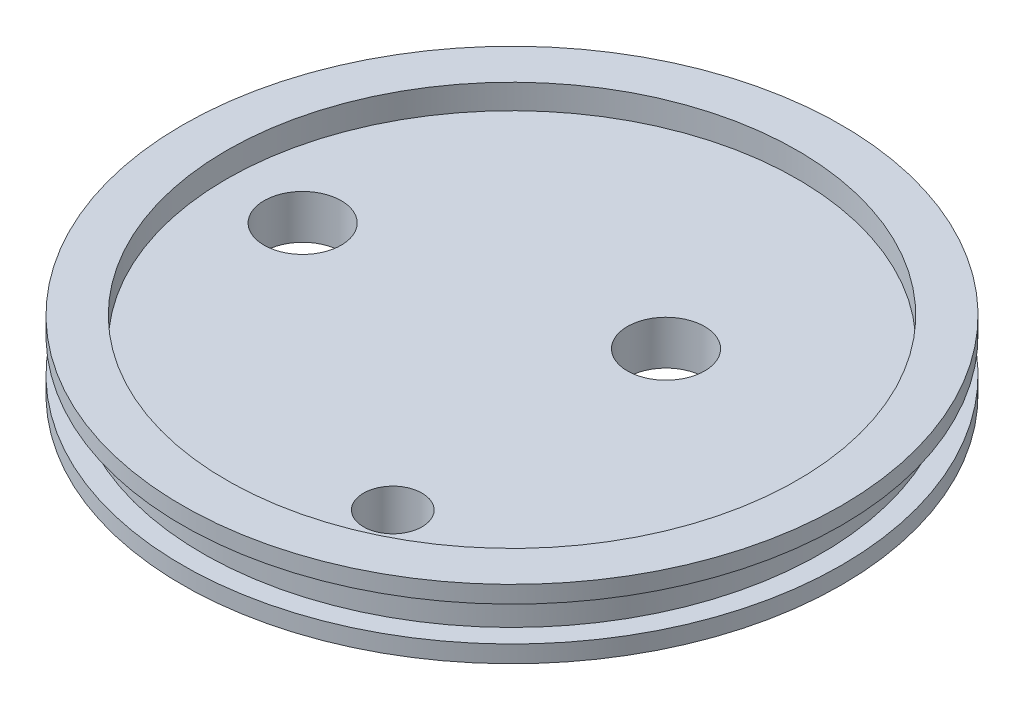
ISO-10303-21;
HEADER;
FILE_DESCRIPTION(('STEP AP214'),'2;1');
FILE_NAME('part.step','',(''),(''),'','','');
FILE_SCHEMA(('AUTOMOTIVE_DESIGN { 1 0 10303 214 1 1 1 1 }'));
ENDSEC;
DATA;
#1=APPLICATION_CONTEXT('core data for automotive mechanical design processes');
#2=APPLICATION_PROTOCOL_DEFINITION('international standard','automotive_design',2000,#1);
#3=PRODUCT_CONTEXT('',#1,'mechanical');
#4=PRODUCT('Part','Part','',(#3));
#5=PRODUCT_RELATED_PRODUCT_CATEGORY('part','',(#4));
#6=PRODUCT_DEFINITION_FORMATION('','',#4);
#7=PRODUCT_DEFINITION_CONTEXT('part definition',#1,'design');
#8=PRODUCT_DEFINITION('design','',#6,#7);
#9=PRODUCT_DEFINITION_SHAPE('','',#8);
#10=(LENGTH_UNIT() NAMED_UNIT(*) SI_UNIT(.MILLI.,.METRE.));
#11=(NAMED_UNIT(*) PLANE_ANGLE_UNIT() SI_UNIT($,.RADIAN.));
#12=(NAMED_UNIT(*) SI_UNIT($,.STERADIAN.) SOLID_ANGLE_UNIT());
#13=UNCERTAINTY_MEASURE_WITH_UNIT(LENGTH_MEASURE(1.E-05),#10,'distance_accuracy_value','');
#14=(GEOMETRIC_REPRESENTATION_CONTEXT(3) GLOBAL_UNCERTAINTY_ASSIGNED_CONTEXT((#13)) GLOBAL_UNIT_ASSIGNED_CONTEXT((#10,
#11,#12)) REPRESENTATION_CONTEXT('',''));
#15=CARTESIAN_POINT('',(0.,0.,0.));
#16=DIRECTION('',(0.,0.,1.));
#17=DIRECTION('',(1.,0.,0.));
#18=AXIS2_PLACEMENT_3D('',#15,#16,#17);
#19=CARTESIAN_POINT('',(0.,0.,0.));
#20=DIRECTION('',(0.,1.,0.));
#21=DIRECTION('',(-1.,0.,0.));
#22=AXIS2_PLACEMENT_3D('',#19,#20,#21);
#23=PLANE('',#22);
#24=CARTESIAN_POINT('',(11.7143411437088,0.,-10.4858709114097));
#25=DIRECTION('',(0.,1.,0.));
#26=DIRECTION('',(-1.,0.,0.));
#27=AXIS2_PLACEMENT_3D('',#24,#25,#26);
#28=CIRCLE('',#27,5.56259999999999);
#29=CARTESIAN_POINT('',(6.15174114370876,0.,-10.4858709114097));
#30=VERTEX_POINT('',#29);
#31=EDGE_CURVE('E79',#30,#30,#28,.T.);
#32=ORIENTED_EDGE('',*,*,#31,.T.);
#33=EDGE_LOOP('',(#32));
#34=FACE_BOUND('',#33,.T.);
#35=CARTESIAN_POINT('',(12.1501989775916,0.,29.3331751572333));
#36=DIRECTION('',(0.,1.,0.));
#37=DIRECTION('',(0.,0.,1.));
#38=AXIS2_PLACEMENT_3D('',#35,#36,#37);
#39=CIRCLE('',#38,4.2164);
#40=CARTESIAN_POINT('',(12.1501989775916,0.,33.5495751572333));
#41=VERTEX_POINT('',#40);
#42=EDGE_CURVE('E73',#41,#41,#39,.T.);
#43=ORIENTED_EDGE('',*,*,#42,.T.);
#44=EDGE_LOOP('',(#43));
#45=FACE_BOUND('',#44,.T.);
#46=CARTESIAN_POINT('',(-30.1752,0.,0.));
#47=DIRECTION('',(0.,1.,0.));
#48=DIRECTION('',(0.,0.,1.));
#49=AXIS2_PLACEMENT_3D('',#46,#47,#48);
#50=CIRCLE('',#49,5.5626);
#51=CARTESIAN_POINT('',(-30.1752,0.,5.5626));
#52=VERTEX_POINT('',#51);
#53=EDGE_CURVE('E67',#52,#52,#50,.T.);
#54=ORIENTED_EDGE('',*,*,#53,.T.);
#55=EDGE_LOOP('',(#54));
#56=FACE_BOUND('',#55,.T.);
#57=CARTESIAN_POINT('',(0.,0.,0.));
#58=DIRECTION('',(0.,1.,0.));
#59=DIRECTION('',(-1.,0.,0.));
#60=AXIS2_PLACEMENT_3D('',#57,#58,#59);
#61=CIRCLE('',#60,47.498);
#62=CARTESIAN_POINT('',(-47.498,0.,0.));
#63=VERTEX_POINT('',#62);
#64=EDGE_CURVE('E10',#63,#63,#61,.T.);
#65=ORIENTED_EDGE('',*,*,#64,.F.);
#66=EDGE_LOOP('',(#65));
#67=FACE_BOUND('',#66,.T.);
#68=ADVANCED_FACE('F36',(#34,#45,#56,#67),#23,.F.);
#69=CARTESIAN_POINT('',(0.,48.1922132313012,0.));
#70=DIRECTION('',(0.,1.,0.));
#71=DIRECTION('',(-1.,0.,0.));
#72=AXIS2_PLACEMENT_3D('',#69,#70,#71);
#73=CYLINDRICAL_SURFACE('',#72,47.498);
#74=CARTESIAN_POINT('',(0.,2.4638,0.));
#75=DIRECTION('',(0.,1.,0.));
#76=DIRECTION('',(-1.,0.,0.));
#77=AXIS2_PLACEMENT_3D('',#74,#75,#76);
#78=CIRCLE('',#77,47.498);
#79=CARTESIAN_POINT('',(-47.498,2.46379999999999,0.));
#80=VERTEX_POINT('',#79);
#81=EDGE_CURVE('E42',#80,#80,#78,.T.);
#82=ORIENTED_EDGE('',*,*,#81,.F.);
#83=EDGE_LOOP('',(#82));
#84=FACE_BOUND('',#83,.T.);
#85=ORIENTED_EDGE('',*,*,#64,.T.);
#86=EDGE_LOOP('',(#85));
#87=FACE_BOUND('',#86,.T.);
#88=ADVANCED_FACE('F131',(#84,#87),#73,.T.);
#89=CARTESIAN_POINT('',(47.498,2.4638,0.));
#90=DIRECTION('',(0.,-1.,0.));
#91=DIRECTION('',(1.,0.,0.));
#92=AXIS2_PLACEMENT_3D('',#89,#90,#91);
#93=PLANE('',#92);
#94=CARTESIAN_POINT('',(0.,2.4638,0.));
#95=DIRECTION('',(0.,1.,0.));
#96=DIRECTION('',(-1.,0.,0.));
#97=AXIS2_PLACEMENT_3D('',#94,#95,#96);
#98=CIRCLE('',#97,44.577);
#99=CARTESIAN_POINT('',(-44.577,2.46379999999999,0.));
#100=VERTEX_POINT('',#99);
#101=EDGE_CURVE('E46',#100,#100,#98,.T.);
#102=ORIENTED_EDGE('',*,*,#101,.F.);
#103=EDGE_LOOP('',(#102));
#104=FACE_BOUND('',#103,.T.);
#105=ORIENTED_EDGE('',*,*,#81,.T.);
#106=EDGE_LOOP('',(#105));
#107=FACE_BOUND('',#106,.T.);
#108=ADVANCED_FACE('F126',(#104,#107),#93,.F.);
#109=CARTESIAN_POINT('',(0.,48.1922132313012,0.));
#110=DIRECTION('',(0.,1.,0.));
#111=DIRECTION('',(-1.,0.,0.));
#112=AXIS2_PLACEMENT_3D('',#109,#110,#111);
#113=CYLINDRICAL_SURFACE('',#112,44.577);
#114=CARTESIAN_POINT('',(0.,7.44219999999999,0.));
#115=DIRECTION('',(0.,1.,0.));
#116=DIRECTION('',(-1.,0.,0.));
#117=AXIS2_PLACEMENT_3D('',#114,#115,#116);
#118=CIRCLE('',#117,44.577);
#119=CARTESIAN_POINT('',(-44.577,7.44219999999998,0.));
#120=VERTEX_POINT('',#119);
#121=EDGE_CURVE('E50',#120,#120,#118,.T.);
#122=ORIENTED_EDGE('',*,*,#121,.F.);
#123=EDGE_LOOP('',(#122));
#124=FACE_BOUND('',#123,.T.);
#125=ORIENTED_EDGE('',*,*,#101,.T.);
#126=EDGE_LOOP('',(#125));
#127=FACE_BOUND('',#126,.T.);
#128=ADVANCED_FACE('F120',(#124,#127),#113,.T.);
#129=CARTESIAN_POINT('',(44.577,7.4422,0.));
#130=DIRECTION('',(0.,1.,0.));
#131=DIRECTION('',(-1.,0.,0.));
#132=AXIS2_PLACEMENT_3D('',#129,#130,#131);
#133=PLANE('',#132);
#134=CARTESIAN_POINT('',(0.,7.44219999999999,0.));
#135=DIRECTION('',(0.,1.,0.));
#136=DIRECTION('',(-1.,0.,0.));
#137=AXIS2_PLACEMENT_3D('',#134,#135,#136);
#138=CIRCLE('',#137,47.498);
#139=CARTESIAN_POINT('',(-47.498,7.44219999999998,0.));
#140=VERTEX_POINT('',#139);
#141=EDGE_CURVE('E55',#140,#140,#138,.T.);
#142=ORIENTED_EDGE('',*,*,#141,.F.);
#143=EDGE_LOOP('',(#142));
#144=FACE_BOUND('',#143,.T.);
#145=ORIENTED_EDGE('',*,*,#121,.T.);
#146=EDGE_LOOP('',(#145));
#147=FACE_BOUND('',#146,.T.);
#148=ADVANCED_FACE('F114',(#144,#147),#133,.F.);
#149=CARTESIAN_POINT('',(0.,48.1922132313012,0.));
#150=DIRECTION('',(0.,1.,0.));
#151=DIRECTION('',(-1.,0.,0.));
#152=AXIS2_PLACEMENT_3D('',#149,#150,#151);
#153=CYLINDRICAL_SURFACE('',#152,47.498);
#154=CARTESIAN_POINT('',(0.,9.90599999999999,0.));
#155=DIRECTION('',(0.,1.,0.));
#156=DIRECTION('',(-1.,0.,0.));
#157=AXIS2_PLACEMENT_3D('',#154,#155,#156);
#158=CIRCLE('',#157,47.498);
#159=CARTESIAN_POINT('',(-47.498,9.90599999999999,0.));
#160=VERTEX_POINT('',#159);
#161=EDGE_CURVE('E58',#160,#160,#158,.T.);
#162=ORIENTED_EDGE('',*,*,#161,.F.);
#163=EDGE_LOOP('',(#162));
#164=FACE_BOUND('',#163,.T.);
#165=ORIENTED_EDGE('',*,*,#141,.T.);
#166=EDGE_LOOP('',(#165));
#167=FACE_BOUND('',#166,.T.);
#168=ADVANCED_FACE('F108',(#164,#167),#153,.T.);
#169=CARTESIAN_POINT('',(47.498,9.906,0.));
#170=DIRECTION('',(0.,-1.,0.));
#171=DIRECTION('',(1.,0.,0.));
#172=AXIS2_PLACEMENT_3D('',#169,#170,#171);
#173=PLANE('',#172);
#174=CARTESIAN_POINT('',(0.,9.90599999999999,0.));
#175=DIRECTION('',(0.,1.,0.));
#176=DIRECTION('',(-1.,0.,0.));
#177=AXIS2_PLACEMENT_3D('',#174,#175,#176);
#178=CIRCLE('',#177,41.148);
#179=CARTESIAN_POINT('',(-41.148,9.90599999999999,0.));
#180=VERTEX_POINT('',#179);
#181=EDGE_CURVE('E61',#180,#180,#178,.T.);
#182=ORIENTED_EDGE('',*,*,#181,.F.);
#183=EDGE_LOOP('',(#182));
#184=FACE_BOUND('',#183,.T.);
#185=ORIENTED_EDGE('',*,*,#161,.T.);
#186=EDGE_LOOP('',(#185));
#187=FACE_BOUND('',#186,.T.);
#188=ADVANCED_FACE('F102',(#184,#187),#173,.F.);
#189=CARTESIAN_POINT('',(0.,48.1922132313012,0.));
#190=DIRECTION('',(0.,1.,0.));
#191=DIRECTION('',(-1.,0.,0.));
#192=AXIS2_PLACEMENT_3D('',#189,#190,#191);
#193=CYLINDRICAL_SURFACE('',#192,41.148);
#194=CARTESIAN_POINT('',(0.,6.34999999999999,0.));
#195=DIRECTION('',(0.,1.,0.));
#196=DIRECTION('',(-1.,0.,0.));
#197=AXIS2_PLACEMENT_3D('',#194,#195,#196);
#198=CIRCLE('',#197,41.148);
#199=CARTESIAN_POINT('',(-41.148,6.34999999999999,0.));
#200=VERTEX_POINT('',#199);
#201=EDGE_CURVE('E64',#200,#200,#198,.T.);
#202=ORIENTED_EDGE('',*,*,#201,.F.);
#203=EDGE_LOOP('',(#202));
#204=FACE_BOUND('',#203,.T.);
#205=ORIENTED_EDGE('',*,*,#181,.T.);
#206=EDGE_LOOP('',(#205));
#207=FACE_BOUND('',#206,.T.);
#208=ADVANCED_FACE('F92',(#204,#207),#193,.F.);
#209=CARTESIAN_POINT('',(41.148,6.35,0.));
#210=DIRECTION('',(0.,-1.,0.));
#211=DIRECTION('',(1.,0.,0.));
#212=AXIS2_PLACEMENT_3D('',#209,#210,#211);
#213=PLANE('',#212);
#214=CARTESIAN_POINT('',(11.7143411437088,6.35,-10.4858709114097));
#215=DIRECTION('',(0.,1.,0.));
#216=DIRECTION('',(0.,0.,1.));
#217=AXIS2_PLACEMENT_3D('',#214,#215,#216);
#218=CIRCLE('',#217,5.56259999999999);
#219=CARTESIAN_POINT('',(11.7143411437088,6.35,-4.92327091140974));
#220=VERTEX_POINT('',#219);
#221=EDGE_CURVE('E82',#220,#220,#218,.T.);
#222=ORIENTED_EDGE('',*,*,#221,.F.);
#223=EDGE_LOOP('',(#222));
#224=FACE_BOUND('',#223,.T.);
#225=CARTESIAN_POINT('',(12.1501989775916,6.35,29.3331751572333));
#226=DIRECTION('',(0.,1.,0.));
#227=DIRECTION('',(0.,0.,1.));
#228=AXIS2_PLACEMENT_3D('',#225,#226,#227);
#229=CIRCLE('',#228,4.2164);
#230=CARTESIAN_POINT('',(12.1501989775916,6.35,33.5495751572333));
#231=VERTEX_POINT('',#230);
#232=EDGE_CURVE('E76',#231,#231,#229,.T.);
#233=ORIENTED_EDGE('',*,*,#232,.F.);
#234=EDGE_LOOP('',(#233));
#235=FACE_BOUND('',#234,.T.);
#236=CARTESIAN_POINT('',(-30.1752,6.34999999999999,0.));
#237=DIRECTION('',(0.,1.,0.));
#238=DIRECTION('',(0.,0.,1.));
#239=AXIS2_PLACEMENT_3D('',#236,#237,#238);
#240=CIRCLE('',#239,5.56259999999999);
#241=CARTESIAN_POINT('',(-30.1752,6.34999999999999,5.56259999999999));
#242=VERTEX_POINT('',#241);
#243=EDGE_CURVE('E70',#242,#242,#240,.T.);
#244=ORIENTED_EDGE('',*,*,#243,.F.);
#245=EDGE_LOOP('',(#244));
#246=FACE_BOUND('',#245,.T.);
#247=ORIENTED_EDGE('',*,*,#201,.T.);
#248=EDGE_LOOP('',(#247));
#249=FACE_BOUND('',#248,.T.);
#250=ADVANCED_FACE('F88',(#224,#235,#246,#249),#213,.F.);
#251=CARTESIAN_POINT('',(-30.1752,6.34999999999999,0.));
#252=DIRECTION('',(0.,1.,0.));
#253=DIRECTION('',(0.,0.,1.));
#254=AXIS2_PLACEMENT_3D('',#251,#252,#253);
#255=CYLINDRICAL_SURFACE('',#254,5.56259999999999);
#256=ORIENTED_EDGE('',*,*,#53,.F.);
#257=EDGE_LOOP('',(#256));
#258=FACE_BOUND('',#257,.T.);
#259=ORIENTED_EDGE('',*,*,#243,.T.);
#260=EDGE_LOOP('',(#259));
#261=FACE_BOUND('',#260,.T.);
#262=ADVANCED_FACE('F91',(#258,#261),#255,.F.);
#263=CARTESIAN_POINT('',(12.1501989775916,6.35,29.3331751572333));
#264=DIRECTION('',(0.,1.,0.));
#265=DIRECTION('',(0.,0.,1.));
#266=AXIS2_PLACEMENT_3D('',#263,#264,#265);
#267=CYLINDRICAL_SURFACE('',#266,4.2164);
#268=ORIENTED_EDGE('',*,*,#42,.F.);
#269=EDGE_LOOP('',(#268));
#270=FACE_BOUND('',#269,.T.);
#271=ORIENTED_EDGE('',*,*,#232,.T.);
#272=EDGE_LOOP('',(#271));
#273=FACE_BOUND('',#272,.T.);
#274=ADVANCED_FACE('F151',(#270,#273),#267,.F.);
#275=CARTESIAN_POINT('',(11.7143411437088,6.35,-10.4858709114097));
#276=DIRECTION('',(0.,1.,0.));
#277=DIRECTION('',(0.,0.,1.));
#278=AXIS2_PLACEMENT_3D('',#275,#276,#277);
#279=CYLINDRICAL_SURFACE('',#278,5.56259999999999);
#280=ORIENTED_EDGE('',*,*,#31,.F.);
#281=EDGE_LOOP('',(#280));
#282=FACE_BOUND('',#281,.T.);
#283=ORIENTED_EDGE('',*,*,#221,.T.);
#284=EDGE_LOOP('',(#283));
#285=FACE_BOUND('',#284,.T.);
#286=ADVANCED_FACE('F86',(#282,#285),#279,.F.);
#287=CLOSED_SHELL('',(#68,#88,#108,#128,#148,#168,#188,#208,#250,#262,#274,#286));
#288=MANIFOLD_SOLID_BREP('B2',#287);
#289=ADVANCED_BREP_SHAPE_REPRESENTATION('',(#18,#288),#14);
#290=SHAPE_DEFINITION_REPRESENTATION(#9,#289);
ENDSEC;
END-ISO-10303-21;
